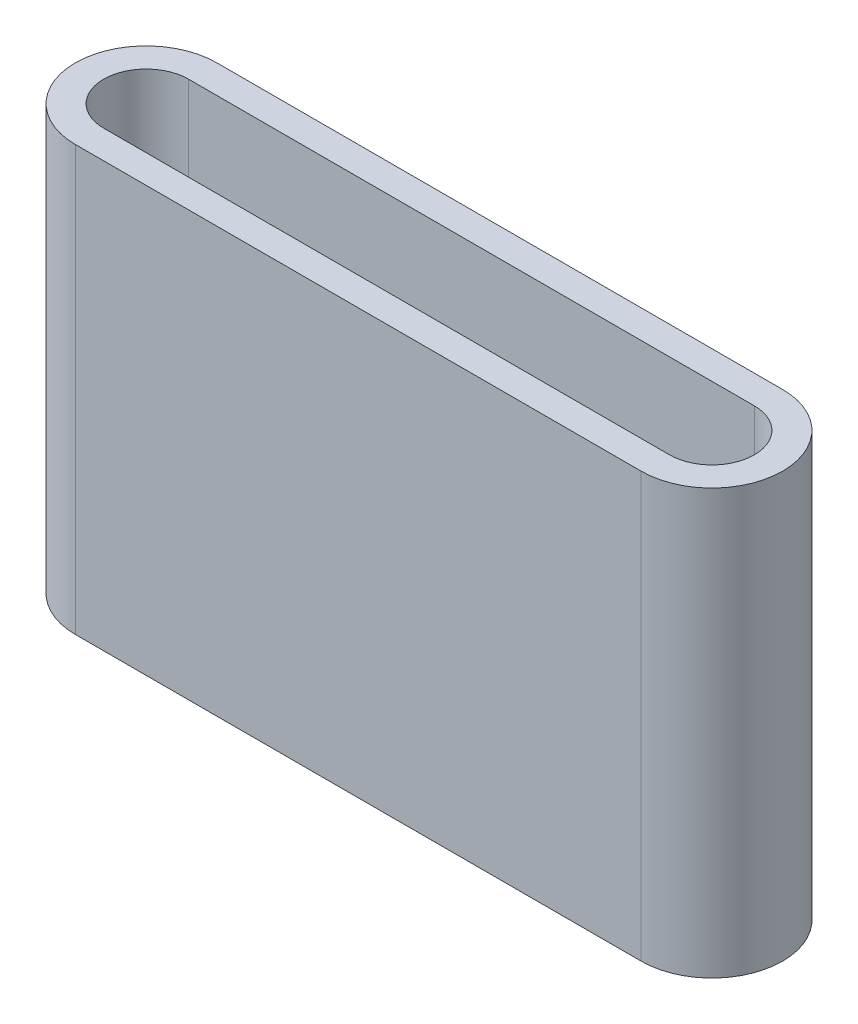
ISO-10303-21;
HEADER;
FILE_DESCRIPTION(('STEP AP214'),'2;1');
FILE_NAME('part.step','',(''),(''),'','','');
FILE_SCHEMA(('AUTOMOTIVE_DESIGN { 1 0 10303 214 1 1 1 1 }'));
ENDSEC;
DATA;
#1=APPLICATION_CONTEXT('core data for automotive mechanical design processes');
#2=APPLICATION_PROTOCOL_DEFINITION('international standard','automotive_design',2000,#1);
#3=PRODUCT_CONTEXT('',#1,'mechanical');
#4=PRODUCT('Part','Part','',(#3));
#5=PRODUCT_RELATED_PRODUCT_CATEGORY('part','',(#4));
#6=PRODUCT_DEFINITION_FORMATION('','',#4);
#7=PRODUCT_DEFINITION_CONTEXT('part definition',#1,'design');
#8=PRODUCT_DEFINITION('design','',#6,#7);
#9=PRODUCT_DEFINITION_SHAPE('','',#8);
#10=(LENGTH_UNIT() NAMED_UNIT(*) SI_UNIT(.MILLI.,.METRE.));
#11=(NAMED_UNIT(*) PLANE_ANGLE_UNIT() SI_UNIT($,.RADIAN.));
#12=(NAMED_UNIT(*) SI_UNIT($,.STERADIAN.) SOLID_ANGLE_UNIT());
#13=UNCERTAINTY_MEASURE_WITH_UNIT(LENGTH_MEASURE(1.E-05),#10,'distance_accuracy_value','');
#14=(GEOMETRIC_REPRESENTATION_CONTEXT(3) GLOBAL_UNCERTAINTY_ASSIGNED_CONTEXT((#13)) GLOBAL_UNIT_ASSIGNED_CONTEXT((#10,
#11,#12)) REPRESENTATION_CONTEXT('',''));
#15=CARTESIAN_POINT('',(0.,0.,0.));
#16=DIRECTION('',(0.,0.,1.));
#17=DIRECTION('',(1.,0.,0.));
#18=AXIS2_PLACEMENT_3D('',#15,#16,#17);
#19=CARTESIAN_POINT('',(-50.2057613168724,20.,0.));
#20=DIRECTION('',(0.,-1.,0.));
#21=DIRECTION('',(0.,0.,-1.));
#22=AXIS2_PLACEMENT_3D('',#19,#20,#21);
#23=CYLINDRICAL_SURFACE('',#22,12.5);
#24=CARTESIAN_POINT('',(-50.2057613168724,0.,0.));
#25=DIRECTION('',(0.,1.,0.));
#26=DIRECTION('',(0.,0.,1.));
#27=AXIS2_PLACEMENT_3D('',#24,#25,#26);
#28=CIRCLE('',#27,12.5);
#29=CARTESIAN_POINT('',(-50.2057613168724,0.,-12.5));
#30=VERTEX_POINT('',#29);
#31=CARTESIAN_POINT('',(-50.2057613168724,0.,12.5));
#32=VERTEX_POINT('',#31);
#33=EDGE_CURVE('E196',#30,#32,#28,.T.);
#34=ORIENTED_EDGE('',*,*,#33,.T.);
#35=DIRECTION('',(0.,-1.,0.));
#36=VECTOR('',#35,1.);
#37=CARTESIAN_POINT('',(-50.2057613168724,20.,12.5));
#38=LINE('',#37,#36);
#39=CARTESIAN_POINT('',(-50.2057613168724,75.,12.5));
#40=VERTEX_POINT('',#39);
#41=EDGE_CURVE('E12',#40,#32,#38,.T.);
#42=ORIENTED_EDGE('',*,*,#41,.F.);
#43=CARTESIAN_POINT('',(-50.2057613168724,75.,0.));
#44=DIRECTION('',(0.,1.,0.));
#45=DIRECTION('',(0.,0.,1.));
#46=AXIS2_PLACEMENT_3D('',#43,#44,#45);
#47=CIRCLE('',#46,12.5);
#48=CARTESIAN_POINT('',(-50.2057613168724,75.,-12.5));
#49=VERTEX_POINT('',#48);
#50=EDGE_CURVE('E149',#49,#40,#47,.T.);
#51=ORIENTED_EDGE('',*,*,#50,.F.);
#52=DIRECTION('',(0.,-1.,0.));
#53=VECTOR('',#52,1.);
#54=CARTESIAN_POINT('',(-50.2057613168724,20.,-12.5));
#55=LINE('',#54,#53);
#56=EDGE_CURVE('E209',#49,#30,#55,.T.);
#57=ORIENTED_EDGE('',*,*,#56,.T.);
#58=EDGE_LOOP('',(#34,#42,#51,#57));
#59=FACE_BOUND('',#58,.T.);
#60=ADVANCED_FACE('F68',(#59),#23,.T.);
#61=CARTESIAN_POINT('',(-50.2057613168724,20.,12.5));
#62=DIRECTION('',(0.,0.,-1.));
#63=DIRECTION('',(-1.,0.,0.));
#64=AXIS2_PLACEMENT_3D('',#61,#62,#63);
#65=PLANE('',#64);
#66=DIRECTION('',(1.,0.,0.));
#67=VECTOR('',#66,1.);
#68=CARTESIAN_POINT('',(-50.2057613168724,0.,12.5));
#69=LINE('',#68,#67);
#70=CARTESIAN_POINT('',(49.7942386831276,0.,12.5));
#71=VERTEX_POINT('',#70);
#72=EDGE_CURVE('E200',#32,#71,#69,.T.);
#73=ORIENTED_EDGE('',*,*,#72,.T.);
#74=DIRECTION('',(0.,-1.,0.));
#75=VECTOR('',#74,1.);
#76=CARTESIAN_POINT('',(49.7942386831276,20.,12.5));
#77=LINE('',#76,#75);
#78=CARTESIAN_POINT('',(49.7942386831276,75.,12.5));
#79=VERTEX_POINT('',#78);
#80=EDGE_CURVE('E76',#79,#71,#77,.T.);
#81=ORIENTED_EDGE('',*,*,#80,.F.);
#82=DIRECTION('',(1.,0.,0.));
#83=VECTOR('',#82,1.);
#84=CARTESIAN_POINT('',(-50.2057613168724,75.,12.5));
#85=LINE('',#84,#83);
#86=EDGE_CURVE('E184',#40,#79,#85,.T.);
#87=ORIENTED_EDGE('',*,*,#86,.F.);
#88=ORIENTED_EDGE('',*,*,#41,.T.);
#89=EDGE_LOOP('',(#73,#81,#87,#88));
#90=FACE_BOUND('',#89,.T.);
#91=ADVANCED_FACE('F234',(#90),#65,.F.);
#92=CARTESIAN_POINT('',(49.7942386831276,20.,0.));
#93=DIRECTION('',(0.,-1.,0.));
#94=DIRECTION('',(0.,0.,-1.));
#95=AXIS2_PLACEMENT_3D('',#92,#93,#94);
#96=CYLINDRICAL_SURFACE('',#95,12.5);
#97=CARTESIAN_POINT('',(49.7942386831276,0.,0.));
#98=DIRECTION('',(0.,1.,0.));
#99=DIRECTION('',(0.,0.,1.));
#100=AXIS2_PLACEMENT_3D('',#97,#98,#99);
#101=CIRCLE('',#100,12.5);
#102=CARTESIAN_POINT('',(49.7942386831276,0.,-12.5));
#103=VERTEX_POINT('',#102);
#104=EDGE_CURVE('E203',#71,#103,#101,.T.);
#105=ORIENTED_EDGE('',*,*,#104,.T.);
#106=DIRECTION('',(0.,-1.,0.));
#107=VECTOR('',#106,1.);
#108=CARTESIAN_POINT('',(49.7942386831276,20.,-12.5));
#109=LINE('',#108,#107);
#110=CARTESIAN_POINT('',(49.7942386831276,75.,-12.5));
#111=VERTEX_POINT('',#110);
#112=EDGE_CURVE('E213',#111,#103,#109,.T.);
#113=ORIENTED_EDGE('',*,*,#112,.F.);
#114=CARTESIAN_POINT('',(49.7942386831276,75.,0.));
#115=DIRECTION('',(0.,1.,0.));
#116=DIRECTION('',(0.,0.,1.));
#117=AXIS2_PLACEMENT_3D('',#114,#115,#116);
#118=CIRCLE('',#117,12.5);
#119=EDGE_CURVE('E188',#79,#111,#118,.T.);
#120=ORIENTED_EDGE('',*,*,#119,.F.);
#121=ORIENTED_EDGE('',*,*,#80,.T.);
#122=EDGE_LOOP('',(#105,#113,#120,#121));
#123=FACE_BOUND('',#122,.T.);
#124=ADVANCED_FACE('F221',(#123),#96,.T.);
#125=CARTESIAN_POINT('',(-50.2057613168724,20.,-12.5));
#126=DIRECTION('',(0.,0.,1.));
#127=DIRECTION('',(1.,0.,0.));
#128=AXIS2_PLACEMENT_3D('',#125,#126,#127);
#129=PLANE('',#128);
#130=DIRECTION('',(-1.,0.,0.));
#131=VECTOR('',#130,1.);
#132=CARTESIAN_POINT('',(-50.2057613168724,0.,-12.5));
#133=LINE('',#132,#131);
#134=EDGE_CURVE('E206',#103,#30,#133,.T.);
#135=ORIENTED_EDGE('',*,*,#134,.T.);
#136=ORIENTED_EDGE('',*,*,#56,.F.);
#137=DIRECTION('',(-1.,0.,0.));
#138=VECTOR('',#137,1.);
#139=CARTESIAN_POINT('',(49.7942386831276,75.,-12.5));
#140=LINE('',#139,#138);
#141=EDGE_CURVE('E192',#111,#49,#140,.T.);
#142=ORIENTED_EDGE('',*,*,#141,.F.);
#143=ORIENTED_EDGE('',*,*,#112,.T.);
#144=EDGE_LOOP('',(#135,#136,#142,#143));
#145=FACE_BOUND('',#144,.T.);
#146=ADVANCED_FACE('F229',(#145),#129,.F.);
#147=CARTESIAN_POINT('',(-50.2057613168724,0.,0.));
#148=DIRECTION('',(0.,1.,0.));
#149=DIRECTION('',(0.,0.,1.));
#150=AXIS2_PLACEMENT_3D('',#147,#148,#149);
#151=PLANE('',#150);
#152=ORIENTED_EDGE('',*,*,#33,.F.);
#153=ORIENTED_EDGE('',*,*,#134,.F.);
#154=ORIENTED_EDGE('',*,*,#104,.F.);
#155=ORIENTED_EDGE('',*,*,#72,.F.);
#156=EDGE_LOOP('',(#152,#153,#154,#155));
#157=FACE_BOUND('',#156,.T.);
#158=ADVANCED_FACE('F227',(#157),#151,.F.);
#159=CARTESIAN_POINT('',(-50.2057613168724,75.,0.));
#160=DIRECTION('',(0.,1.,0.));
#161=DIRECTION('',(0.,0.,1.));
#162=AXIS2_PLACEMENT_3D('',#159,#160,#161);
#163=PLANE('',#162);
#164=ORIENTED_EDGE('',*,*,#50,.T.);
#165=ORIENTED_EDGE('',*,*,#86,.T.);
#166=ORIENTED_EDGE('',*,*,#119,.T.);
#167=ORIENTED_EDGE('',*,*,#141,.T.);
#168=EDGE_LOOP('',(#164,#165,#166,#167));
#169=FACE_BOUND('',#168,.T.);
#170=DIRECTION('',(1.,0.,0.));
#171=VECTOR('',#170,1.);
#172=CARTESIAN_POINT('',(-50.2057613168724,75.,7.5));
#173=LINE('',#172,#171);
#174=CARTESIAN_POINT('',(-50.2057613168724,75.,7.5));
#175=VERTEX_POINT('',#174);
#176=CARTESIAN_POINT('',(49.7942386831276,75.,7.5));
#177=VERTEX_POINT('',#176);
#178=EDGE_CURVE('E142',#175,#177,#173,.T.);
#179=ORIENTED_EDGE('',*,*,#178,.F.);
#180=CARTESIAN_POINT('',(-50.2057613168724,75.,0.));
#181=DIRECTION('',(0.,1.,0.));
#182=DIRECTION('',(1.,0.,0.));
#183=AXIS2_PLACEMENT_3D('',#180,#181,#182);
#184=CIRCLE('',#183,7.5);
#185=CARTESIAN_POINT('',(-50.2057613168724,75.,-7.5));
#186=VERTEX_POINT('',#185);
#187=EDGE_CURVE('E132',#186,#175,#184,.T.);
#188=ORIENTED_EDGE('',*,*,#187,.F.);
#189=DIRECTION('',(-1.,0.,0.));
#190=VECTOR('',#189,1.);
#191=CARTESIAN_POINT('',(49.7942386831276,75.,-7.5));
#192=LINE('',#191,#190);
#193=CARTESIAN_POINT('',(49.7942386831276,75.,-7.5));
#194=VERTEX_POINT('',#193);
#195=EDGE_CURVE('E159',#194,#186,#192,.T.);
#196=ORIENTED_EDGE('',*,*,#195,.F.);
#197=CARTESIAN_POINT('',(49.7942386831276,75.,0.));
#198=DIRECTION('',(0.,1.,0.));
#199=DIRECTION('',(1.,0.,0.));
#200=AXIS2_PLACEMENT_3D('',#197,#198,#199);
#201=CIRCLE('',#200,7.5);
#202=EDGE_CURVE('E155',#177,#194,#201,.T.);
#203=ORIENTED_EDGE('',*,*,#202,.F.);
#204=EDGE_LOOP('',(#179,#188,#196,#203));
#205=FACE_BOUND('',#204,.T.);
#206=ADVANCED_FACE('F153',(#169,#205),#163,.T.);
#207=CARTESIAN_POINT('',(-50.2057613168724,75.,0.));
#208=DIRECTION('',(0.,-1.,0.));
#209=DIRECTION('',(0.,0.,-1.));
#210=AXIS2_PLACEMENT_3D('',#207,#208,#209);
#211=CYLINDRICAL_SURFACE('',#210,7.5);
#212=CARTESIAN_POINT('',(-50.2057613168724,20.,0.));
#213=DIRECTION('',(0.,1.,0.));
#214=DIRECTION('',(1.,0.,0.));
#215=AXIS2_PLACEMENT_3D('',#212,#213,#214);
#216=CIRCLE('',#215,7.5);
#217=CARTESIAN_POINT('',(-50.2057613168724,20.,-7.5));
#218=VERTEX_POINT('',#217);
#219=CARTESIAN_POINT('',(-50.2057613168724,20.,7.5));
#220=VERTEX_POINT('',#219);
#221=EDGE_CURVE('E83',#218,#220,#216,.T.);
#222=ORIENTED_EDGE('',*,*,#221,.F.);
#223=DIRECTION('',(0.,-1.,0.));
#224=VECTOR('',#223,1.);
#225=CARTESIAN_POINT('',(-50.2057613168724,75.,-7.5));
#226=LINE('',#225,#224);
#227=EDGE_CURVE('E137',#186,#218,#226,.T.);
#228=ORIENTED_EDGE('',*,*,#227,.F.);
#229=ORIENTED_EDGE('',*,*,#187,.T.);
#230=DIRECTION('',(0.,-1.,0.));
#231=VECTOR('',#230,1.);
#232=CARTESIAN_POINT('',(-50.2057613168724,75.,7.5));
#233=LINE('',#232,#231);
#234=EDGE_CURVE('E135',#175,#220,#233,.T.);
#235=ORIENTED_EDGE('',*,*,#234,.T.);
#236=EDGE_LOOP('',(#222,#228,#229,#235));
#237=FACE_BOUND('',#236,.T.);
#238=ADVANCED_FACE('F134',(#237),#211,.F.);
#239=CARTESIAN_POINT('',(-50.2057613168724,75.,7.5));
#240=DIRECTION('',(0.,0.,-1.));
#241=DIRECTION('',(-1.,0.,0.));
#242=AXIS2_PLACEMENT_3D('',#239,#240,#241);
#243=PLANE('',#242);
#244=DIRECTION('',(1.,0.,0.));
#245=VECTOR('',#244,1.);
#246=CARTESIAN_POINT('',(-50.2057613168724,20.,7.5));
#247=LINE('',#246,#245);
#248=CARTESIAN_POINT('',(49.7942386831276,20.,7.5));
#249=VERTEX_POINT('',#248);
#250=EDGE_CURVE('E87',#220,#249,#247,.T.);
#251=ORIENTED_EDGE('',*,*,#250,.F.);
#252=ORIENTED_EDGE('',*,*,#234,.F.);
#253=ORIENTED_EDGE('',*,*,#178,.T.);
#254=DIRECTION('',(0.,-1.,0.));
#255=VECTOR('',#254,1.);
#256=CARTESIAN_POINT('',(49.7942386831276,75.,7.5));
#257=LINE('',#256,#255);
#258=EDGE_CURVE('E150',#177,#249,#257,.T.);
#259=ORIENTED_EDGE('',*,*,#258,.T.);
#260=EDGE_LOOP('',(#251,#252,#253,#259));
#261=FACE_BOUND('',#260,.T.);
#262=ADVANCED_FACE('F146',(#261),#243,.T.);
#263=CARTESIAN_POINT('',(49.7942386831276,75.,0.));
#264=DIRECTION('',(0.,-1.,0.));
#265=DIRECTION('',(0.,0.,-1.));
#266=AXIS2_PLACEMENT_3D('',#263,#264,#265);
#267=CYLINDRICAL_SURFACE('',#266,7.5);
#268=CARTESIAN_POINT('',(49.7942386831276,20.,0.));
#269=DIRECTION('',(0.,1.,0.));
#270=DIRECTION('',(1.,0.,0.));
#271=AXIS2_PLACEMENT_3D('',#268,#269,#270);
#272=CIRCLE('',#271,7.5);
#273=CARTESIAN_POINT('',(49.7942386831276,20.,-7.5));
#274=VERTEX_POINT('',#273);
#275=EDGE_CURVE('E168',#249,#274,#272,.T.);
#276=ORIENTED_EDGE('',*,*,#275,.F.);
#277=ORIENTED_EDGE('',*,*,#258,.F.);
#278=ORIENTED_EDGE('',*,*,#202,.T.);
#279=DIRECTION('',(0.,-1.,0.));
#280=VECTOR('',#279,1.);
#281=CARTESIAN_POINT('',(49.7942386831276,75.,-7.5));
#282=LINE('',#281,#280);
#283=EDGE_CURVE('E175',#194,#274,#282,.T.);
#284=ORIENTED_EDGE('',*,*,#283,.T.);
#285=EDGE_LOOP('',(#276,#277,#278,#284));
#286=FACE_BOUND('',#285,.T.);
#287=ADVANCED_FACE('F256',(#286),#267,.F.);
#288=CARTESIAN_POINT('',(49.7942386831276,75.,-7.5));
#289=DIRECTION('',(0.,0.,1.));
#290=DIRECTION('',(1.,0.,0.));
#291=AXIS2_PLACEMENT_3D('',#288,#289,#290);
#292=PLANE('',#291);
#293=DIRECTION('',(-1.,0.,0.));
#294=VECTOR('',#293,1.);
#295=CARTESIAN_POINT('',(49.7942386831276,20.,-7.5));
#296=LINE('',#295,#294);
#297=EDGE_CURVE('E143',#274,#218,#296,.T.);
#298=ORIENTED_EDGE('',*,*,#297,.F.);
#299=ORIENTED_EDGE('',*,*,#283,.F.);
#300=ORIENTED_EDGE('',*,*,#195,.T.);
#301=ORIENTED_EDGE('',*,*,#227,.T.);
#302=EDGE_LOOP('',(#298,#299,#300,#301));
#303=FACE_BOUND('',#302,.T.);
#304=ADVANCED_FACE('F249',(#303),#292,.T.);
#305=CARTESIAN_POINT('',(-50.2057613168724,20.,0.));
#306=DIRECTION('',(0.,1.,0.));
#307=DIRECTION('',(0.,0.,1.));
#308=AXIS2_PLACEMENT_3D('',#305,#306,#307);
#309=PLANE('',#308);
#310=ORIENTED_EDGE('',*,*,#221,.T.);
#311=ORIENTED_EDGE('',*,*,#250,.T.);
#312=ORIENTED_EDGE('',*,*,#275,.T.);
#313=ORIENTED_EDGE('',*,*,#297,.T.);
#314=EDGE_LOOP('',(#310,#311,#312,#313));
#315=FACE_BOUND('',#314,.T.);
#316=ADVANCED_FACE('F246',(#315),#309,.T.);
#317=CLOSED_SHELL('',(#60,#91,#124,#146,#158,#206,#238,#262,#287,#304,#316));
#318=MANIFOLD_SOLID_BREP('B2',#317);
#319=ADVANCED_BREP_SHAPE_REPRESENTATION('',(#18,#318),#14);
#320=SHAPE_DEFINITION_REPRESENTATION(#9,#319);
ENDSEC;
END-ISO-10303-21;
